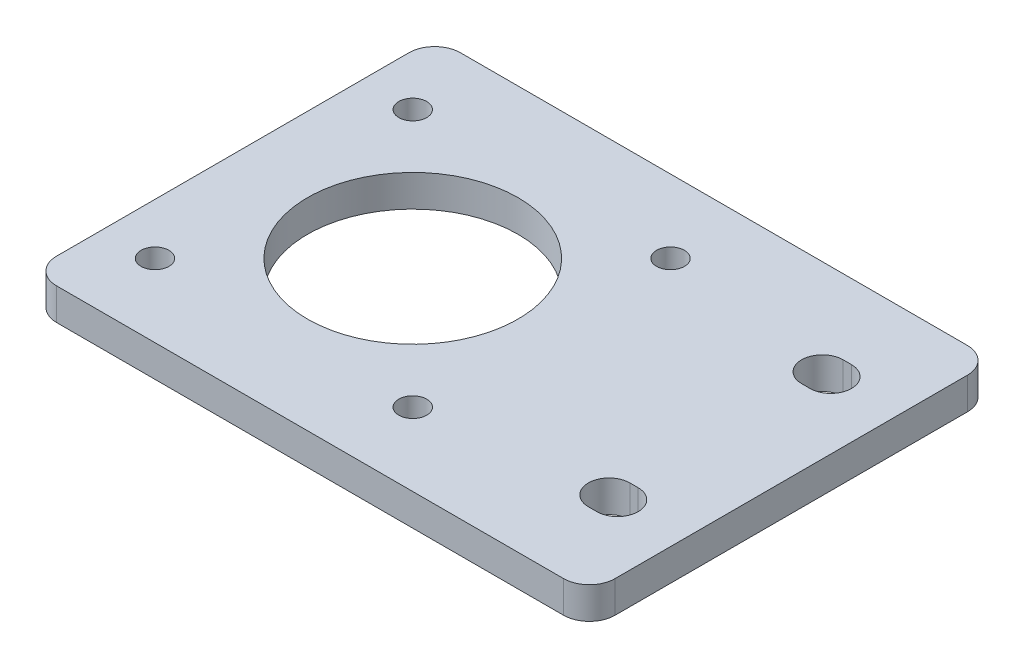
ISO-10303-21;
HEADER;
FILE_DESCRIPTION(('STEP AP214'),'2;1');
FILE_NAME('part.step','',(''),(''),'','','');
FILE_SCHEMA(('AUTOMOTIVE_DESIGN { 1 0 10303 214 1 1 1 1 }'));
ENDSEC;
DATA;
#1=APPLICATION_CONTEXT('core data for automotive mechanical design processes');
#2=APPLICATION_PROTOCOL_DEFINITION('international standard','automotive_design',2000,#1);
#3=PRODUCT_CONTEXT('',#1,'mechanical');
#4=PRODUCT('Part','Part','',(#3));
#5=PRODUCT_RELATED_PRODUCT_CATEGORY('part','',(#4));
#6=PRODUCT_DEFINITION_FORMATION('','',#4);
#7=PRODUCT_DEFINITION_CONTEXT('part definition',#1,'design');
#8=PRODUCT_DEFINITION('design','',#6,#7);
#9=PRODUCT_DEFINITION_SHAPE('','',#8);
#10=(LENGTH_UNIT() NAMED_UNIT(*) SI_UNIT(.MILLI.,.METRE.));
#11=(NAMED_UNIT(*) PLANE_ANGLE_UNIT() SI_UNIT($,.RADIAN.));
#12=(NAMED_UNIT(*) SI_UNIT($,.STERADIAN.) SOLID_ANGLE_UNIT());
#13=UNCERTAINTY_MEASURE_WITH_UNIT(LENGTH_MEASURE(1.E-05),#10,'distance_accuracy_value','');
#14=(GEOMETRIC_REPRESENTATION_CONTEXT(3) GLOBAL_UNCERTAINTY_ASSIGNED_CONTEXT((#13)) GLOBAL_UNIT_ASSIGNED_CONTEXT((#10,
#11,#12)) REPRESENTATION_CONTEXT('',''));
#15=CARTESIAN_POINT('',(0.,0.,0.));
#16=DIRECTION('',(0.,0.,1.));
#17=DIRECTION('',(1.,0.,0.));
#18=AXIS2_PLACEMENT_3D('',#15,#16,#17);
#19=CARTESIAN_POINT('',(0.,3.7,0.));
#20=DIRECTION('',(0.,-1.,0.));
#21=DIRECTION('',(0.,0.,-1.));
#22=AXIS2_PLACEMENT_3D('',#19,#20,#21);
#23=PLANE('',#22);
#24=CARTESIAN_POINT('',(39.3569900361446,3.7,1.63237025517979));
#25=DIRECTION('',(0.,1.,0.));
#26=DIRECTION('',(0.,0.,1.));
#27=AXIS2_PLACEMENT_3D('',#24,#25,#26);
#28=CIRCLE('',#27,2.41000000000001);
#29=CARTESIAN_POINT('',(39.3569900361446,3.7,-0.777629744820214));
#30=VERTEX_POINT('',#29);
#31=CARTESIAN_POINT('',(39.3569900361446,3.7,4.0423702551798));
#32=VERTEX_POINT('',#31);
#33=EDGE_CURVE('E189',#30,#32,#28,.T.);
#34=ORIENTED_EDGE('',*,*,#33,.F.);
#35=DIRECTION('',(-1.,0.,0.));
#36=VECTOR('',#35,1.);
#37=CARTESIAN_POINT('',(39.3569900361446,3.7,-0.777629744820214));
#38=LINE('',#37,#36);
#39=CARTESIAN_POINT('',(40.3369900361446,3.7,-0.777629744820207));
#40=VERTEX_POINT('',#39);
#41=EDGE_CURVE('E197',#40,#30,#38,.T.);
#42=ORIENTED_EDGE('',*,*,#41,.F.);
#43=CARTESIAN_POINT('',(40.3369900361446,3.7,1.63237025517979));
#44=DIRECTION('',(0.,1.,0.));
#45=DIRECTION('',(0.,0.,1.));
#46=AXIS2_PLACEMENT_3D('',#43,#44,#45);
#47=CIRCLE('',#46,2.41);
#48=CARTESIAN_POINT('',(40.3369900361446,3.7,4.04237025517979));
#49=VERTEX_POINT('',#48);
#50=EDGE_CURVE('E194',#49,#40,#47,.T.);
#51=ORIENTED_EDGE('',*,*,#50,.F.);
#52=DIRECTION('',(1.,0.,0.));
#53=VECTOR('',#52,1.);
#54=CARTESIAN_POINT('',(39.3569900361446,3.7,4.0423702551798));
#55=LINE('',#54,#53);
#56=EDGE_CURVE('E191',#32,#49,#55,.T.);
#57=ORIENTED_EDGE('',*,*,#56,.F.);
#58=EDGE_LOOP('',(#34,#42,#51,#57));
#59=FACE_BOUND('',#58,.T.);
#60=DIRECTION('',(-1.,0.,0.));
#61=VECTOR('',#60,1.);
#62=CARTESIAN_POINT('',(-16.8530099638554,3.7,-34.2776297448202));
#63=LINE('',#62,#61);
#64=CARTESIAN_POINT('',(45.1469900361446,3.7,-34.2776297448202));
#65=VERTEX_POINT('',#64);
#66=CARTESIAN_POINT('',(-13.8530099638554,3.7,-34.2776297448202));
#67=VERTEX_POINT('',#66);
#68=EDGE_CURVE('E258',#65,#67,#63,.T.);
#69=ORIENTED_EDGE('',*,*,#68,.T.);
#70=CARTESIAN_POINT('',(-13.8530099638554,3.7,-31.2776297448202));
#71=DIRECTION('',(0.,-1.,0.));
#72=DIRECTION('',(0.,0.,-1.));
#73=AXIS2_PLACEMENT_3D('',#70,#71,#72);
#74=CIRCLE('',#73,3.);
#75=CARTESIAN_POINT('',(-16.8530099638554,3.7,-31.2776297448202));
#76=VERTEX_POINT('',#75);
#77=EDGE_CURVE('E293',#67,#76,#74,.F.);
#78=ORIENTED_EDGE('',*,*,#77,.T.);
#79=DIRECTION('',(0.,0.,1.));
#80=VECTOR('',#79,1.);
#81=CARTESIAN_POINT('',(-16.8530099638554,3.7,12.7223702551798));
#82=LINE('',#81,#80);
#83=CARTESIAN_POINT('',(-16.8530099638554,3.7,9.72237025517979));
#84=VERTEX_POINT('',#83);
#85=EDGE_CURVE('E250',#76,#84,#82,.T.);
#86=ORIENTED_EDGE('',*,*,#85,.T.);
#87=CARTESIAN_POINT('',(-13.8530099638554,3.7,9.72237025517979));
#88=DIRECTION('',(0.,-1.,0.));
#89=DIRECTION('',(0.,0.,-1.));
#90=AXIS2_PLACEMENT_3D('',#87,#88,#89);
#91=CIRCLE('',#90,3.);
#92=CARTESIAN_POINT('',(-13.8530099638554,3.7,12.7223702551798));
#93=VERTEX_POINT('',#92);
#94=EDGE_CURVE('E289',#84,#93,#91,.F.);
#95=ORIENTED_EDGE('',*,*,#94,.T.);
#96=DIRECTION('',(1.,0.,0.));
#97=VECTOR('',#96,1.);
#98=CARTESIAN_POINT('',(-16.8530099638554,3.7,12.7223702551798));
#99=LINE('',#98,#97);
#100=CARTESIAN_POINT('',(45.1469900361446,3.7,12.7223702551798));
#101=VERTEX_POINT('',#100);
#102=EDGE_CURVE('E253',#93,#101,#99,.T.);
#103=ORIENTED_EDGE('',*,*,#102,.T.);
#104=CARTESIAN_POINT('',(45.1469900361446,3.7,9.72237025517979));
#105=DIRECTION('',(0.,-1.,0.));
#106=DIRECTION('',(0.,0.,-1.));
#107=AXIS2_PLACEMENT_3D('',#104,#105,#106);
#108=CIRCLE('',#107,3.);
#109=CARTESIAN_POINT('',(48.1469900361446,3.7,9.72237025517979));
#110=VERTEX_POINT('',#109);
#111=EDGE_CURVE('E54',#101,#110,#108,.F.);
#112=ORIENTED_EDGE('',*,*,#111,.T.);
#113=DIRECTION('',(0.,0.,-1.));
#114=VECTOR('',#113,1.);
#115=CARTESIAN_POINT('',(48.1469900361446,3.7,12.7223702551798));
#116=LINE('',#115,#114);
#117=CARTESIAN_POINT('',(48.1469900361446,3.7,-31.2776297448202));
#118=VERTEX_POINT('',#117);
#119=EDGE_CURVE('E256',#110,#118,#116,.T.);
#120=ORIENTED_EDGE('',*,*,#119,.T.);
#121=CARTESIAN_POINT('',(45.1469900361446,3.7,-31.2776297448202));
#122=DIRECTION('',(0.,-1.,0.));
#123=DIRECTION('',(0.,0.,-1.));
#124=AXIS2_PLACEMENT_3D('',#121,#122,#123);
#125=CIRCLE('',#124,3.);
#126=EDGE_CURVE('E291',#118,#65,#125,.F.);
#127=ORIENTED_EDGE('',*,*,#126,.T.);
#128=EDGE_LOOP('',(#69,#78,#86,#95,#103,#112,#120,#127));
#129=FACE_BOUND('',#128,.T.);
#130=CARTESIAN_POINT('',(4.09699003614461,3.7,-10.7776297448202));
#131=DIRECTION('',(0.,1.,0.));
#132=DIRECTION('',(0.,0.,1.));
#133=AXIS2_PLACEMENT_3D('',#130,#131,#132);
#134=CIRCLE('',#133,12.25);
#135=CARTESIAN_POINT('',(4.09699003614461,3.7,1.47237025517979));
#136=VERTEX_POINT('',#135);
#137=EDGE_CURVE('E244',#136,#136,#134,.T.);
#138=ORIENTED_EDGE('',*,*,#137,.F.);
#139=EDGE_LOOP('',(#138));
#140=FACE_BOUND('',#139,.T.);
#141=CARTESIAN_POINT('',(-10.9030099638554,3.7,4.22237025517979));
#142=DIRECTION('',(0.,1.,0.));
#143=DIRECTION('',(0.,0.,1.));
#144=AXIS2_PLACEMENT_3D('',#141,#142,#143);
#145=CIRCLE('',#144,1.62384984749867);
#146=CARTESIAN_POINT('',(-10.9030099638554,3.7,5.84622010267846));
#147=VERTEX_POINT('',#146);
#148=EDGE_CURVE('E238',#147,#147,#145,.T.);
#149=ORIENTED_EDGE('',*,*,#148,.F.);
#150=EDGE_LOOP('',(#149));
#151=FACE_BOUND('',#150,.T.);
#152=CARTESIAN_POINT('',(19.0969900361446,3.7,4.22237025517979));
#153=DIRECTION('',(0.,1.,0.));
#154=DIRECTION('',(0.,0.,1.));
#155=AXIS2_PLACEMENT_3D('',#152,#153,#154);
#156=CIRCLE('',#155,1.62384984749867);
#157=CARTESIAN_POINT('',(19.0969900361446,3.7,5.84622010267846));
#158=VERTEX_POINT('',#157);
#159=EDGE_CURVE('E232',#158,#158,#156,.T.);
#160=ORIENTED_EDGE('',*,*,#159,.F.);
#161=EDGE_LOOP('',(#160));
#162=FACE_BOUND('',#161,.T.);
#163=CARTESIAN_POINT('',(19.0969900361445,3.7,-25.7776297448202));
#164=DIRECTION('',(0.,1.,0.));
#165=DIRECTION('',(0.,0.,1.));
#166=AXIS2_PLACEMENT_3D('',#163,#164,#165);
#167=CIRCLE('',#166,1.62384984749867);
#168=CARTESIAN_POINT('',(19.0969900361445,3.7,-24.1537798973215));
#169=VERTEX_POINT('',#168);
#170=EDGE_CURVE('E226',#169,#169,#167,.T.);
#171=ORIENTED_EDGE('',*,*,#170,.F.);
#172=EDGE_LOOP('',(#171));
#173=FACE_BOUND('',#172,.T.);
#174=CARTESIAN_POINT('',(-10.9030099638555,3.7,-25.7776297448202));
#175=DIRECTION('',(0.,1.,0.));
#176=DIRECTION('',(0.,0.,1.));
#177=AXIS2_PLACEMENT_3D('',#174,#175,#176);
#178=CIRCLE('',#177,1.62384984749867);
#179=CARTESIAN_POINT('',(-10.9030099638555,3.7,-24.1537798973215));
#180=VERTEX_POINT('',#179);
#181=EDGE_CURVE('E220',#180,#180,#178,.T.);
#182=ORIENTED_EDGE('',*,*,#181,.F.);
#183=EDGE_LOOP('',(#182));
#184=FACE_BOUND('',#183,.T.);
#185=CARTESIAN_POINT('',(39.3569900361446,3.7,-23.1876297448202));
#186=DIRECTION('',(0.,1.,0.));
#187=DIRECTION('',(0.,0.,-1.));
#188=AXIS2_PLACEMENT_3D('',#185,#186,#187);
#189=CIRCLE('',#188,2.41);
#190=CARTESIAN_POINT('',(39.3569900361446,3.7,-25.5976297448202));
#191=VERTEX_POINT('',#190);
#192=CARTESIAN_POINT('',(39.3569900361446,3.7,-20.7776297448202));
#193=VERTEX_POINT('',#192);
#194=EDGE_CURVE('E148',#191,#193,#189,.T.);
#195=ORIENTED_EDGE('',*,*,#194,.F.);
#196=DIRECTION('',(-1.,0.,0.));
#197=VECTOR('',#196,1.);
#198=CARTESIAN_POINT('',(39.3569900361446,3.7,-25.5976297448202));
#199=LINE('',#198,#197);
#200=CARTESIAN_POINT('',(40.3369900361446,3.7,-25.5976297448202));
#201=VERTEX_POINT('',#200);
#202=EDGE_CURVE('E173',#201,#191,#199,.T.);
#203=ORIENTED_EDGE('',*,*,#202,.F.);
#204=CARTESIAN_POINT('',(40.3369900361446,3.7,-23.1876297448202));
#205=DIRECTION('',(0.,1.,0.));
#206=DIRECTION('',(0.,0.,-1.));
#207=AXIS2_PLACEMENT_3D('',#204,#205,#206);
#208=CIRCLE('',#207,2.41);
#209=CARTESIAN_POINT('',(40.3369900361446,3.7,-20.7776297448202));
#210=VERTEX_POINT('',#209);
#211=EDGE_CURVE('E171',#210,#201,#208,.T.);
#212=ORIENTED_EDGE('',*,*,#211,.F.);
#213=DIRECTION('',(1.,0.,0.));
#214=VECTOR('',#213,1.);
#215=CARTESIAN_POINT('',(39.3569900361446,3.7,-20.7776297448202));
#216=LINE('',#215,#214);
#217=EDGE_CURVE('E158',#193,#210,#216,.T.);
#218=ORIENTED_EDGE('',*,*,#217,.F.);
#219=EDGE_LOOP('',(#195,#203,#212,#218));
#220=FACE_BOUND('',#219,.T.);
#221=ADVANCED_FACE('F32',(#59,#129,#140,#151,#162,#173,#184,#220),#23,.F.);
#222=CARTESIAN_POINT('',(0.,0.,0.));
#223=DIRECTION('',(0.,-1.,0.));
#224=DIRECTION('',(0.,0.,-1.));
#225=AXIS2_PLACEMENT_3D('',#222,#223,#224);
#226=PLANE('',#225);
#227=CARTESIAN_POINT('',(19.0969900361445,0.,-25.7776297448202));
#228=DIRECTION('',(0.,1.,0.));
#229=DIRECTION('',(0.,0.,1.));
#230=AXIS2_PLACEMENT_3D('',#227,#228,#229);
#231=CIRCLE('',#230,1.62384984749867);
#232=CARTESIAN_POINT('',(19.0969900361445,0.,-24.1537798973215));
#233=VERTEX_POINT('',#232);
#234=EDGE_CURVE('E223',#233,#233,#231,.T.);
#235=ORIENTED_EDGE('',*,*,#234,.T.);
#236=EDGE_LOOP('',(#235));
#237=FACE_BOUND('',#236,.T.);
#238=CARTESIAN_POINT('',(-10.9030099638554,0.,4.22237025517979));
#239=DIRECTION('',(0.,1.,0.));
#240=DIRECTION('',(0.,0.,1.));
#241=AXIS2_PLACEMENT_3D('',#238,#239,#240);
#242=CIRCLE('',#241,1.62384984749867);
#243=CARTESIAN_POINT('',(-10.9030099638554,0.,5.84622010267846));
#244=VERTEX_POINT('',#243);
#245=EDGE_CURVE('E235',#244,#244,#242,.T.);
#246=ORIENTED_EDGE('',*,*,#245,.T.);
#247=EDGE_LOOP('',(#246));
#248=FACE_BOUND('',#247,.T.);
#249=DIRECTION('',(0.,0.,1.));
#250=VECTOR('',#249,1.);
#251=CARTESIAN_POINT('',(-16.8530099638554,0.,12.7223702551798));
#252=LINE('',#251,#250);
#253=CARTESIAN_POINT('',(-16.8530099638554,0.,-31.2776297448202));
#254=VERTEX_POINT('',#253);
#255=CARTESIAN_POINT('',(-16.8530099638554,0.,9.72237025517979));
#256=VERTEX_POINT('',#255);
#257=EDGE_CURVE('E247',#254,#256,#252,.T.);
#258=ORIENTED_EDGE('',*,*,#257,.F.);
#259=CARTESIAN_POINT('',(-13.8530099638554,0.,-31.2776297448202));
#260=DIRECTION('',(0.,-1.,0.));
#261=DIRECTION('',(0.,0.,-1.));
#262=AXIS2_PLACEMENT_3D('',#259,#260,#261);
#263=CIRCLE('',#262,3.);
#264=CARTESIAN_POINT('',(-13.8530099638554,0.,-34.2776297448202));
#265=VERTEX_POINT('',#264);
#266=EDGE_CURVE('E281',#254,#265,#263,.T.);
#267=ORIENTED_EDGE('',*,*,#266,.T.);
#268=DIRECTION('',(-1.,0.,0.));
#269=VECTOR('',#268,1.);
#270=CARTESIAN_POINT('',(-16.8530099638554,0.,-34.2776297448202));
#271=LINE('',#270,#269);
#272=CARTESIAN_POINT('',(45.1469900361446,0.,-34.2776297448202));
#273=VERTEX_POINT('',#272);
#274=EDGE_CURVE('E254',#273,#265,#271,.T.);
#275=ORIENTED_EDGE('',*,*,#274,.F.);
#276=CARTESIAN_POINT('',(45.1469900361446,0.,-31.2776297448202));
#277=DIRECTION('',(0.,-1.,0.));
#278=DIRECTION('',(0.,0.,-1.));
#279=AXIS2_PLACEMENT_3D('',#276,#277,#278);
#280=CIRCLE('',#279,3.);
#281=CARTESIAN_POINT('',(48.1469900361446,0.,-31.2776297448202));
#282=VERTEX_POINT('',#281);
#283=EDGE_CURVE('E279',#273,#282,#280,.T.);
#284=ORIENTED_EDGE('',*,*,#283,.T.);
#285=DIRECTION('',(0.,0.,-1.));
#286=VECTOR('',#285,1.);
#287=CARTESIAN_POINT('',(48.1469900361446,0.,12.7223702551798));
#288=LINE('',#287,#286);
#289=CARTESIAN_POINT('',(48.1469900361446,0.,9.72237025517979));
#290=VERTEX_POINT('',#289);
#291=EDGE_CURVE('E267',#290,#282,#288,.T.);
#292=ORIENTED_EDGE('',*,*,#291,.F.);
#293=CARTESIAN_POINT('',(45.1469900361446,0.,9.72237025517979));
#294=DIRECTION('',(0.,-1.,0.));
#295=DIRECTION('',(0.,0.,-1.));
#296=AXIS2_PLACEMENT_3D('',#293,#294,#295);
#297=CIRCLE('',#296,3.);
#298=CARTESIAN_POINT('',(45.1469900361446,0.,12.7223702551798));
#299=VERTEX_POINT('',#298);
#300=EDGE_CURVE('E275',#290,#299,#297,.T.);
#301=ORIENTED_EDGE('',*,*,#300,.T.);
#302=DIRECTION('',(1.,0.,0.));
#303=VECTOR('',#302,1.);
#304=CARTESIAN_POINT('',(-16.8530099638554,0.,12.7223702551798));
#305=LINE('',#304,#303);
#306=CARTESIAN_POINT('',(-13.8530099638554,0.,12.7223702551798));
#307=VERTEX_POINT('',#306);
#308=EDGE_CURVE('E264',#307,#299,#305,.T.);
#309=ORIENTED_EDGE('',*,*,#308,.F.);
#310=CARTESIAN_POINT('',(-13.8530099638554,0.,9.72237025517979));
#311=DIRECTION('',(0.,-1.,0.));
#312=DIRECTION('',(0.,0.,-1.));
#313=AXIS2_PLACEMENT_3D('',#310,#311,#312);
#314=CIRCLE('',#313,3.);
#315=EDGE_CURVE('E277',#307,#256,#314,.T.);
#316=ORIENTED_EDGE('',*,*,#315,.T.);
#317=EDGE_LOOP('',(#258,#267,#275,#284,#292,#301,#309,#316));
#318=FACE_BOUND('',#317,.T.);
#319=CARTESIAN_POINT('',(4.09699003614461,0.,-10.7776297448202));
#320=DIRECTION('',(0.,1.,0.));
#321=DIRECTION('',(0.,0.,1.));
#322=AXIS2_PLACEMENT_3D('',#319,#320,#321);
#323=CIRCLE('',#322,12.25);
#324=CARTESIAN_POINT('',(4.09699003614461,0.,1.47237025517979));
#325=VERTEX_POINT('',#324);
#326=EDGE_CURVE('E241',#325,#325,#323,.T.);
#327=ORIENTED_EDGE('',*,*,#326,.T.);
#328=EDGE_LOOP('',(#327));
#329=FACE_BOUND('',#328,.T.);
#330=CARTESIAN_POINT('',(19.0969900361446,0.,4.22237025517979));
#331=DIRECTION('',(0.,1.,0.));
#332=DIRECTION('',(0.,0.,1.));
#333=AXIS2_PLACEMENT_3D('',#330,#331,#332);
#334=CIRCLE('',#333,1.62384984749867);
#335=CARTESIAN_POINT('',(19.0969900361446,0.,5.84622010267846));
#336=VERTEX_POINT('',#335);
#337=EDGE_CURVE('E229',#336,#336,#334,.T.);
#338=ORIENTED_EDGE('',*,*,#337,.T.);
#339=EDGE_LOOP('',(#338));
#340=FACE_BOUND('',#339,.T.);
#341=CARTESIAN_POINT('',(-10.9030099638555,0.,-25.7776297448202));
#342=DIRECTION('',(0.,1.,0.));
#343=DIRECTION('',(0.,0.,1.));
#344=AXIS2_PLACEMENT_3D('',#341,#342,#343);
#345=CIRCLE('',#344,1.62384984749867);
#346=CARTESIAN_POINT('',(-10.9030099638555,0.,-24.1537798973215));
#347=VERTEX_POINT('',#346);
#348=EDGE_CURVE('E219',#347,#347,#345,.T.);
#349=ORIENTED_EDGE('',*,*,#348,.T.);
#350=EDGE_LOOP('',(#349));
#351=FACE_BOUND('',#350,.T.);
#352=DIRECTION('',(-1.,0.,0.));
#353=VECTOR('',#352,1.);
#354=CARTESIAN_POINT('',(39.3569900361446,0.,-0.777629744820214));
#355=LINE('',#354,#353);
#356=CARTESIAN_POINT('',(40.3369900361446,0.,-0.777629744820207));
#357=VERTEX_POINT('',#356);
#358=CARTESIAN_POINT('',(39.3569900361446,0.,-0.777629744820214));
#359=VERTEX_POINT('',#358);
#360=EDGE_CURVE('E192',#357,#359,#355,.T.);
#361=ORIENTED_EDGE('',*,*,#360,.T.);
#362=CARTESIAN_POINT('',(39.3569900361446,0.,1.63237025517979));
#363=DIRECTION('',(0.,1.,0.));
#364=DIRECTION('',(0.,0.,1.));
#365=AXIS2_PLACEMENT_3D('',#362,#363,#364);
#366=CIRCLE('',#365,2.41000000000001);
#367=CARTESIAN_POINT('',(39.3569900361446,0.,4.0423702551798));
#368=VERTEX_POINT('',#367);
#369=EDGE_CURVE('E166',#359,#368,#366,.T.);
#370=ORIENTED_EDGE('',*,*,#369,.T.);
#371=DIRECTION('',(1.,0.,0.));
#372=VECTOR('',#371,1.);
#373=CARTESIAN_POINT('',(39.3569900361446,0.,4.0423702551798));
#374=LINE('',#373,#372);
#375=CARTESIAN_POINT('',(40.3369900361446,0.,4.04237025517979));
#376=VERTEX_POINT('',#375);
#377=EDGE_CURVE('E202',#368,#376,#374,.T.);
#378=ORIENTED_EDGE('',*,*,#377,.T.);
#379=CARTESIAN_POINT('',(40.3369900361446,0.,1.63237025517979));
#380=DIRECTION('',(0.,1.,0.));
#381=DIRECTION('',(0.,0.,1.));
#382=AXIS2_PLACEMENT_3D('',#379,#380,#381);
#383=CIRCLE('',#382,2.41);
#384=EDGE_CURVE('E205',#376,#357,#383,.T.);
#385=ORIENTED_EDGE('',*,*,#384,.T.);
#386=EDGE_LOOP('',(#361,#370,#378,#385));
#387=FACE_BOUND('',#386,.T.);
#388=DIRECTION('',(-1.,0.,0.));
#389=VECTOR('',#388,1.);
#390=CARTESIAN_POINT('',(39.3569900361446,0.,-25.5976297448202));
#391=LINE('',#390,#389);
#392=CARTESIAN_POINT('',(40.3369900361446,0.,-25.5976297448202));
#393=VERTEX_POINT('',#392);
#394=CARTESIAN_POINT('',(39.3569900361446,0.,-25.5976297448202));
#395=VERTEX_POINT('',#394);
#396=EDGE_CURVE('E159',#393,#395,#391,.T.);
#397=ORIENTED_EDGE('',*,*,#396,.T.);
#398=CARTESIAN_POINT('',(39.3569900361446,0.,-23.1876297448202));
#399=DIRECTION('',(0.,1.,0.));
#400=DIRECTION('',(0.,0.,-1.));
#401=AXIS2_PLACEMENT_3D('',#398,#399,#400);
#402=CIRCLE('',#401,2.41);
#403=CARTESIAN_POINT('',(39.3569900361446,0.,-20.7776297448202));
#404=VERTEX_POINT('',#403);
#405=EDGE_CURVE('E177',#395,#404,#402,.T.);
#406=ORIENTED_EDGE('',*,*,#405,.T.);
#407=DIRECTION('',(1.,0.,0.));
#408=VECTOR('',#407,1.);
#409=CARTESIAN_POINT('',(39.3569900361446,0.,-20.7776297448202));
#410=LINE('',#409,#408);
#411=CARTESIAN_POINT('',(40.3369900361446,0.,-20.7776297448202));
#412=VERTEX_POINT('',#411);
#413=EDGE_CURVE('E165',#404,#412,#410,.T.);
#414=ORIENTED_EDGE('',*,*,#413,.T.);
#415=CARTESIAN_POINT('',(40.3369900361446,0.,-23.1876297448202));
#416=DIRECTION('',(0.,1.,0.));
#417=DIRECTION('',(0.,0.,-1.));
#418=AXIS2_PLACEMENT_3D('',#415,#416,#417);
#419=CIRCLE('',#418,2.41);
#420=EDGE_CURVE('E180',#412,#393,#419,.T.);
#421=ORIENTED_EDGE('',*,*,#420,.T.);
#422=EDGE_LOOP('',(#397,#406,#414,#421));
#423=FACE_BOUND('',#422,.T.);
#424=ADVANCED_FACE('F312',(#237,#248,#318,#329,#340,#351,#387,#423),#226,.T.);
#425=CARTESIAN_POINT('',(-16.8530099638554,3.7,12.7223702551798));
#426=DIRECTION('',(1.,0.,0.));
#427=DIRECTION('',(0.,0.,-1.));
#428=AXIS2_PLACEMENT_3D('',#425,#426,#427);
#429=PLANE('',#428);
#430=ORIENTED_EDGE('',*,*,#85,.F.);
#431=DIRECTION('',(0.,-1.,0.));
#432=VECTOR('',#431,1.);
#433=CARTESIAN_POINT('',(-16.8530099638554,3.7,-31.2776297448202));
#434=LINE('',#433,#432);
#435=EDGE_CURVE('E272',#76,#254,#434,.T.);
#436=ORIENTED_EDGE('',*,*,#435,.T.);
#437=ORIENTED_EDGE('',*,*,#257,.T.);
#438=DIRECTION('',(0.,-1.,0.));
#439=VECTOR('',#438,1.);
#440=CARTESIAN_POINT('',(-16.8530099638554,3.7,9.72237025517979));
#441=LINE('',#440,#439);
#442=EDGE_CURVE('E261',#256,#84,#441,.F.);
#443=ORIENTED_EDGE('',*,*,#442,.T.);
#444=EDGE_LOOP('',(#430,#436,#437,#443));
#445=FACE_BOUND('',#444,.T.);
#446=ADVANCED_FACE('F329',(#445),#429,.F.);
#447=CARTESIAN_POINT('',(-16.8530099638554,3.7,12.7223702551798));
#448=DIRECTION('',(0.,0.,-1.));
#449=DIRECTION('',(-1.,0.,0.));
#450=AXIS2_PLACEMENT_3D('',#447,#448,#449);
#451=PLANE('',#450);
#452=ORIENTED_EDGE('',*,*,#102,.F.);
#453=DIRECTION('',(0.,-1.,0.));
#454=VECTOR('',#453,1.);
#455=CARTESIAN_POINT('',(-13.8530099638554,3.7,12.7223702551798));
#456=LINE('',#455,#454);
#457=EDGE_CURVE('E11',#93,#307,#456,.T.);
#458=ORIENTED_EDGE('',*,*,#457,.T.);
#459=ORIENTED_EDGE('',*,*,#308,.T.);
#460=DIRECTION('',(0.,-1.,0.));
#461=VECTOR('',#460,1.);
#462=CARTESIAN_POINT('',(45.1469900361446,3.7,12.7223702551798));
#463=LINE('',#462,#461);
#464=EDGE_CURVE('E40',#299,#101,#463,.F.);
#465=ORIENTED_EDGE('',*,*,#464,.T.);
#466=EDGE_LOOP('',(#452,#458,#459,#465));
#467=FACE_BOUND('',#466,.T.);
#468=ADVANCED_FACE('F301',(#467),#451,.F.);
#469=CARTESIAN_POINT('',(48.1469900361446,3.7,12.7223702551798));
#470=DIRECTION('',(-1.,0.,0.));
#471=DIRECTION('',(0.,0.,1.));
#472=AXIS2_PLACEMENT_3D('',#469,#470,#471);
#473=PLANE('',#472);
#474=ORIENTED_EDGE('',*,*,#291,.T.);
#475=DIRECTION('',(0.,-1.,0.));
#476=VECTOR('',#475,1.);
#477=CARTESIAN_POINT('',(48.1469900361446,3.7,-31.2776297448202));
#478=LINE('',#477,#476);
#479=EDGE_CURVE('E47',#282,#118,#478,.F.);
#480=ORIENTED_EDGE('',*,*,#479,.T.);
#481=ORIENTED_EDGE('',*,*,#119,.F.);
#482=DIRECTION('',(0.,-1.,0.));
#483=VECTOR('',#482,1.);
#484=CARTESIAN_POINT('',(48.1469900361446,3.7,9.72237025517979));
#485=LINE('',#484,#483);
#486=EDGE_CURVE('E295',#110,#290,#485,.T.);
#487=ORIENTED_EDGE('',*,*,#486,.T.);
#488=EDGE_LOOP('',(#474,#480,#481,#487));
#489=FACE_BOUND('',#488,.T.);
#490=ADVANCED_FACE('F309',(#489),#473,.F.);
#491=CARTESIAN_POINT('',(-16.8530099638554,3.7,-34.2776297448202));
#492=DIRECTION('',(0.,0.,1.));
#493=DIRECTION('',(1.,0.,0.));
#494=AXIS2_PLACEMENT_3D('',#491,#492,#493);
#495=PLANE('',#494);
#496=ORIENTED_EDGE('',*,*,#274,.T.);
#497=DIRECTION('',(0.,-1.,0.));
#498=VECTOR('',#497,1.);
#499=CARTESIAN_POINT('',(-13.8530099638554,3.7,-34.2776297448202));
#500=LINE('',#499,#498);
#501=EDGE_CURVE('E286',#265,#67,#500,.F.);
#502=ORIENTED_EDGE('',*,*,#501,.T.);
#503=ORIENTED_EDGE('',*,*,#68,.F.);
#504=DIRECTION('',(0.,-1.,0.));
#505=VECTOR('',#504,1.);
#506=CARTESIAN_POINT('',(45.1469900361446,3.7,-34.2776297448202));
#507=LINE('',#506,#505);
#508=EDGE_CURVE('E283',#65,#273,#507,.T.);
#509=ORIENTED_EDGE('',*,*,#508,.T.);
#510=EDGE_LOOP('',(#496,#502,#503,#509));
#511=FACE_BOUND('',#510,.T.);
#512=ADVANCED_FACE('F321',(#511),#495,.F.);
#513=CARTESIAN_POINT('',(4.09699003614461,3.7,-10.7776297448202));
#514=DIRECTION('',(0.,-1.,0.));
#515=DIRECTION('',(0.,0.,-1.));
#516=AXIS2_PLACEMENT_3D('',#513,#514,#515);
#517=CYLINDRICAL_SURFACE('',#516,12.25);
#518=ORIENTED_EDGE('',*,*,#137,.T.);
#519=EDGE_LOOP('',(#518));
#520=FACE_BOUND('',#519,.T.);
#521=ORIENTED_EDGE('',*,*,#326,.F.);
#522=EDGE_LOOP('',(#521));
#523=FACE_BOUND('',#522,.T.);
#524=ADVANCED_FACE('F349',(#520,#523),#517,.F.);
#525=CARTESIAN_POINT('',(-10.9030099638554,3.7,4.22237025517979));
#526=DIRECTION('',(0.,-1.,0.));
#527=DIRECTION('',(0.,0.,-1.));
#528=AXIS2_PLACEMENT_3D('',#525,#526,#527);
#529=CYLINDRICAL_SURFACE('',#528,1.62384984749867);
#530=ORIENTED_EDGE('',*,*,#148,.T.);
#531=EDGE_LOOP('',(#530));
#532=FACE_BOUND('',#531,.T.);
#533=ORIENTED_EDGE('',*,*,#245,.F.);
#534=EDGE_LOOP('',(#533));
#535=FACE_BOUND('',#534,.T.);
#536=ADVANCED_FACE('F405',(#532,#535),#529,.F.);
#537=CARTESIAN_POINT('',(19.0969900361446,3.7,4.22237025517979));
#538=DIRECTION('',(0.,-1.,0.));
#539=DIRECTION('',(0.,0.,-1.));
#540=AXIS2_PLACEMENT_3D('',#537,#538,#539);
#541=CYLINDRICAL_SURFACE('',#540,1.62384984749867);
#542=ORIENTED_EDGE('',*,*,#159,.T.);
#543=EDGE_LOOP('',(#542));
#544=FACE_BOUND('',#543,.T.);
#545=ORIENTED_EDGE('',*,*,#337,.F.);
#546=EDGE_LOOP('',(#545));
#547=FACE_BOUND('',#546,.T.);
#548=ADVANCED_FACE('F402',(#544,#547),#541,.F.);
#549=CARTESIAN_POINT('',(19.0969900361445,3.7,-25.7776297448202));
#550=DIRECTION('',(0.,-1.,0.));
#551=DIRECTION('',(0.,0.,-1.));
#552=AXIS2_PLACEMENT_3D('',#549,#550,#551);
#553=CYLINDRICAL_SURFACE('',#552,1.62384984749867);
#554=ORIENTED_EDGE('',*,*,#170,.T.);
#555=EDGE_LOOP('',(#554));
#556=FACE_BOUND('',#555,.T.);
#557=ORIENTED_EDGE('',*,*,#234,.F.);
#558=EDGE_LOOP('',(#557));
#559=FACE_BOUND('',#558,.T.);
#560=ADVANCED_FACE('F398',(#556,#559),#553,.F.);
#561=CARTESIAN_POINT('',(-10.9030099638555,3.7,-25.7776297448202));
#562=DIRECTION('',(0.,-1.,0.));
#563=DIRECTION('',(0.,0.,-1.));
#564=AXIS2_PLACEMENT_3D('',#561,#562,#563);
#565=CYLINDRICAL_SURFACE('',#564,1.62384984749867);
#566=ORIENTED_EDGE('',*,*,#181,.T.);
#567=EDGE_LOOP('',(#566));
#568=FACE_BOUND('',#567,.T.);
#569=ORIENTED_EDGE('',*,*,#348,.F.);
#570=EDGE_LOOP('',(#569));
#571=FACE_BOUND('',#570,.T.);
#572=ADVANCED_FACE('F394',(#568,#571),#565,.F.);
#573=CARTESIAN_POINT('',(39.3569900361446,3.7,1.63237025517979));
#574=DIRECTION('',(0.,-1.,0.));
#575=DIRECTION('',(0.,0.,-1.));
#576=AXIS2_PLACEMENT_3D('',#573,#574,#575);
#577=CYLINDRICAL_SURFACE('',#576,2.41000000000001);
#578=ORIENTED_EDGE('',*,*,#369,.F.);
#579=DIRECTION('',(0.,-1.,0.));
#580=VECTOR('',#579,1.);
#581=CARTESIAN_POINT('',(39.3569900361446,3.7,-0.777629744820214));
#582=LINE('',#581,#580);
#583=EDGE_CURVE('E199',#30,#359,#582,.T.);
#584=ORIENTED_EDGE('',*,*,#583,.F.);
#585=ORIENTED_EDGE('',*,*,#33,.T.);
#586=DIRECTION('',(0.,-1.,0.));
#587=VECTOR('',#586,1.);
#588=CARTESIAN_POINT('',(39.3569900361446,3.7,4.0423702551798));
#589=LINE('',#588,#587);
#590=EDGE_CURVE('E216',#32,#368,#589,.T.);
#591=ORIENTED_EDGE('',*,*,#590,.T.);
#592=EDGE_LOOP('',(#578,#584,#585,#591));
#593=FACE_BOUND('',#592,.T.);
#594=ADVANCED_FACE('F390',(#593),#577,.F.);
#595=CARTESIAN_POINT('',(39.3569900361446,3.7,4.0423702551798));
#596=DIRECTION('',(0.,0.,-1.));
#597=DIRECTION('',(-1.,0.,0.));
#598=AXIS2_PLACEMENT_3D('',#595,#596,#597);
#599=PLANE('',#598);
#600=ORIENTED_EDGE('',*,*,#377,.F.);
#601=ORIENTED_EDGE('',*,*,#590,.F.);
#602=ORIENTED_EDGE('',*,*,#56,.T.);
#603=DIRECTION('',(0.,-1.,0.));
#604=VECTOR('',#603,1.);
#605=CARTESIAN_POINT('',(40.3369900361446,3.7,4.04237025517979));
#606=LINE('',#605,#604);
#607=EDGE_CURVE('E214',#49,#376,#606,.T.);
#608=ORIENTED_EDGE('',*,*,#607,.T.);
#609=EDGE_LOOP('',(#600,#601,#602,#608));
#610=FACE_BOUND('',#609,.T.);
#611=ADVANCED_FACE('F386',(#610),#599,.T.);
#612=CARTESIAN_POINT('',(40.3369900361446,3.7,1.63237025517979));
#613=DIRECTION('',(0.,-1.,0.));
#614=DIRECTION('',(0.,0.,-1.));
#615=AXIS2_PLACEMENT_3D('',#612,#613,#614);
#616=CYLINDRICAL_SURFACE('',#615,2.41);
#617=ORIENTED_EDGE('',*,*,#384,.F.);
#618=ORIENTED_EDGE('',*,*,#607,.F.);
#619=ORIENTED_EDGE('',*,*,#50,.T.);
#620=DIRECTION('',(0.,-1.,0.));
#621=VECTOR('',#620,1.);
#622=CARTESIAN_POINT('',(40.3369900361446,3.7,-0.777629744820207));
#623=LINE('',#622,#621);
#624=EDGE_CURVE('E212',#40,#357,#623,.T.);
#625=ORIENTED_EDGE('',*,*,#624,.T.);
#626=EDGE_LOOP('',(#617,#618,#619,#625));
#627=FACE_BOUND('',#626,.T.);
#628=ADVANCED_FACE('F382',(#627),#616,.F.);
#629=CARTESIAN_POINT('',(39.3569900361446,3.7,-0.777629744820214));
#630=DIRECTION('',(0.,0.,1.));
#631=DIRECTION('',(1.,0.,0.));
#632=AXIS2_PLACEMENT_3D('',#629,#630,#631);
#633=PLANE('',#632);
#634=ORIENTED_EDGE('',*,*,#360,.F.);
#635=ORIENTED_EDGE('',*,*,#624,.F.);
#636=ORIENTED_EDGE('',*,*,#41,.T.);
#637=ORIENTED_EDGE('',*,*,#583,.T.);
#638=EDGE_LOOP('',(#634,#635,#636,#637));
#639=FACE_BOUND('',#638,.T.);
#640=ADVANCED_FACE('F379',(#639),#633,.T.);
#641=CARTESIAN_POINT('',(39.3569900361446,3.7,-23.1876297448202));
#642=DIRECTION('',(0.,-1.,0.));
#643=DIRECTION('',(0.,0.,-1.));
#644=AXIS2_PLACEMENT_3D('',#641,#642,#643);
#645=CYLINDRICAL_SURFACE('',#644,2.41);
#646=ORIENTED_EDGE('',*,*,#405,.F.);
#647=DIRECTION('',(0.,-1.,0.));
#648=VECTOR('',#647,1.);
#649=CARTESIAN_POINT('',(39.3569900361446,3.7,-25.5976297448202));
#650=LINE('',#649,#648);
#651=EDGE_CURVE('E154',#191,#395,#650,.T.);
#652=ORIENTED_EDGE('',*,*,#651,.F.);
#653=ORIENTED_EDGE('',*,*,#194,.T.);
#654=DIRECTION('',(0.,-1.,0.));
#655=VECTOR('',#654,1.);
#656=CARTESIAN_POINT('',(39.3569900361446,3.7,-20.7776297448202));
#657=LINE('',#656,#655);
#658=EDGE_CURVE('E151',#193,#404,#657,.T.);
#659=ORIENTED_EDGE('',*,*,#658,.T.);
#660=EDGE_LOOP('',(#646,#652,#653,#659));
#661=FACE_BOUND('',#660,.T.);
#662=ADVANCED_FACE('F150',(#661),#645,.F.);
#663=CARTESIAN_POINT('',(39.3569900361446,3.7,-20.7776297448202));
#664=DIRECTION('',(0.,0.,-1.));
#665=DIRECTION('',(-1.,0.,0.));
#666=AXIS2_PLACEMENT_3D('',#663,#664,#665);
#667=PLANE('',#666);
#668=ORIENTED_EDGE('',*,*,#413,.F.);
#669=ORIENTED_EDGE('',*,*,#658,.F.);
#670=ORIENTED_EDGE('',*,*,#217,.T.);
#671=DIRECTION('',(0.,-1.,0.));
#672=VECTOR('',#671,1.);
#673=CARTESIAN_POINT('',(40.3369900361446,3.7,-20.7776297448202));
#674=LINE('',#673,#672);
#675=EDGE_CURVE('E167',#210,#412,#674,.T.);
#676=ORIENTED_EDGE('',*,*,#675,.T.);
#677=EDGE_LOOP('',(#668,#669,#670,#676));
#678=FACE_BOUND('',#677,.T.);
#679=ADVANCED_FACE('F162',(#678),#667,.T.);
#680=CARTESIAN_POINT('',(40.3369900361446,3.7,-23.1876297448202));
#681=DIRECTION('',(0.,-1.,0.));
#682=DIRECTION('',(0.,0.,-1.));
#683=AXIS2_PLACEMENT_3D('',#680,#681,#682);
#684=CYLINDRICAL_SURFACE('',#683,2.41);
#685=ORIENTED_EDGE('',*,*,#420,.F.);
#686=ORIENTED_EDGE('',*,*,#675,.F.);
#687=ORIENTED_EDGE('',*,*,#211,.T.);
#688=DIRECTION('',(0.,-1.,0.));
#689=VECTOR('',#688,1.);
#690=CARTESIAN_POINT('',(40.3369900361446,3.7,-25.5976297448202));
#691=LINE('',#690,#689);
#692=EDGE_CURVE('E186',#201,#393,#691,.T.);
#693=ORIENTED_EDGE('',*,*,#692,.T.);
#694=EDGE_LOOP('',(#685,#686,#687,#693));
#695=FACE_BOUND('',#694,.T.);
#696=ADVANCED_FACE('F365',(#695),#684,.F.);
#697=CARTESIAN_POINT('',(39.3569900361446,3.7,-25.5976297448202));
#698=DIRECTION('',(0.,0.,1.));
#699=DIRECTION('',(1.,0.,0.));
#700=AXIS2_PLACEMENT_3D('',#697,#698,#699);
#701=PLANE('',#700);
#702=ORIENTED_EDGE('',*,*,#396,.F.);
#703=ORIENTED_EDGE('',*,*,#692,.F.);
#704=ORIENTED_EDGE('',*,*,#202,.T.);
#705=ORIENTED_EDGE('',*,*,#651,.T.);
#706=EDGE_LOOP('',(#702,#703,#704,#705));
#707=FACE_BOUND('',#706,.T.);
#708=ADVANCED_FACE('F361',(#707),#701,.T.);
#709=CARTESIAN_POINT('',(-13.8530099638554,3.7,-31.2776297448202));
#710=DIRECTION('',(0.,-1.,0.));
#711=DIRECTION('',(0.,0.,-1.));
#712=AXIS2_PLACEMENT_3D('',#709,#710,#711);
#713=CYLINDRICAL_SURFACE('',#712,3.);
#714=ORIENTED_EDGE('',*,*,#77,.F.);
#715=ORIENTED_EDGE('',*,*,#501,.F.);
#716=ORIENTED_EDGE('',*,*,#266,.F.);
#717=ORIENTED_EDGE('',*,*,#435,.F.);
#718=EDGE_LOOP('',(#714,#715,#716,#717));
#719=FACE_BOUND('',#718,.T.);
#720=ADVANCED_FACE('F327',(#719),#713,.T.);
#721=CARTESIAN_POINT('',(45.1469900361446,3.7,-31.2776297448202));
#722=DIRECTION('',(0.,-1.,0.));
#723=DIRECTION('',(0.,0.,-1.));
#724=AXIS2_PLACEMENT_3D('',#721,#722,#723);
#725=CYLINDRICAL_SURFACE('',#724,3.);
#726=ORIENTED_EDGE('',*,*,#126,.F.);
#727=ORIENTED_EDGE('',*,*,#479,.F.);
#728=ORIENTED_EDGE('',*,*,#283,.F.);
#729=ORIENTED_EDGE('',*,*,#508,.F.);
#730=EDGE_LOOP('',(#726,#727,#728,#729));
#731=FACE_BOUND('',#730,.T.);
#732=ADVANCED_FACE('F318',(#731),#725,.T.);
#733=CARTESIAN_POINT('',(-13.8530099638554,3.7,9.72237025517979));
#734=DIRECTION('',(0.,-1.,0.));
#735=DIRECTION('',(0.,0.,-1.));
#736=AXIS2_PLACEMENT_3D('',#733,#734,#735);
#737=CYLINDRICAL_SURFACE('',#736,3.);
#738=ORIENTED_EDGE('',*,*,#94,.F.);
#739=ORIENTED_EDGE('',*,*,#442,.F.);
#740=ORIENTED_EDGE('',*,*,#315,.F.);
#741=ORIENTED_EDGE('',*,*,#457,.F.);
#742=EDGE_LOOP('',(#738,#739,#740,#741));
#743=FACE_BOUND('',#742,.T.);
#744=ADVANCED_FACE('F332',(#743),#737,.T.);
#745=CARTESIAN_POINT('',(45.1469900361446,3.7,9.72237025517979));
#746=DIRECTION('',(0.,-1.,0.));
#747=DIRECTION('',(0.,0.,-1.));
#748=AXIS2_PLACEMENT_3D('',#745,#746,#747);
#749=CYLINDRICAL_SURFACE('',#748,3.);
#750=ORIENTED_EDGE('',*,*,#111,.F.);
#751=ORIENTED_EDGE('',*,*,#464,.F.);
#752=ORIENTED_EDGE('',*,*,#300,.F.);
#753=ORIENTED_EDGE('',*,*,#486,.F.);
#754=EDGE_LOOP('',(#750,#751,#752,#753));
#755=FACE_BOUND('',#754,.T.);
#756=ADVANCED_FACE('F34',(#755),#749,.T.);
#757=CLOSED_SHELL('',(#221,#424,#446,#468,#490,#512,#524,#536,#548,#560,#572,#594,#611,#628,
#640,#662,#679,#696,#708,#720,#732,#744,#756));
#758=MANIFOLD_SOLID_BREP('B2',#757);
#759=ADVANCED_BREP_SHAPE_REPRESENTATION('',(#18,#758),#14);
#760=SHAPE_DEFINITION_REPRESENTATION(#9,#759);
ENDSEC;
END-ISO-10303-21;
